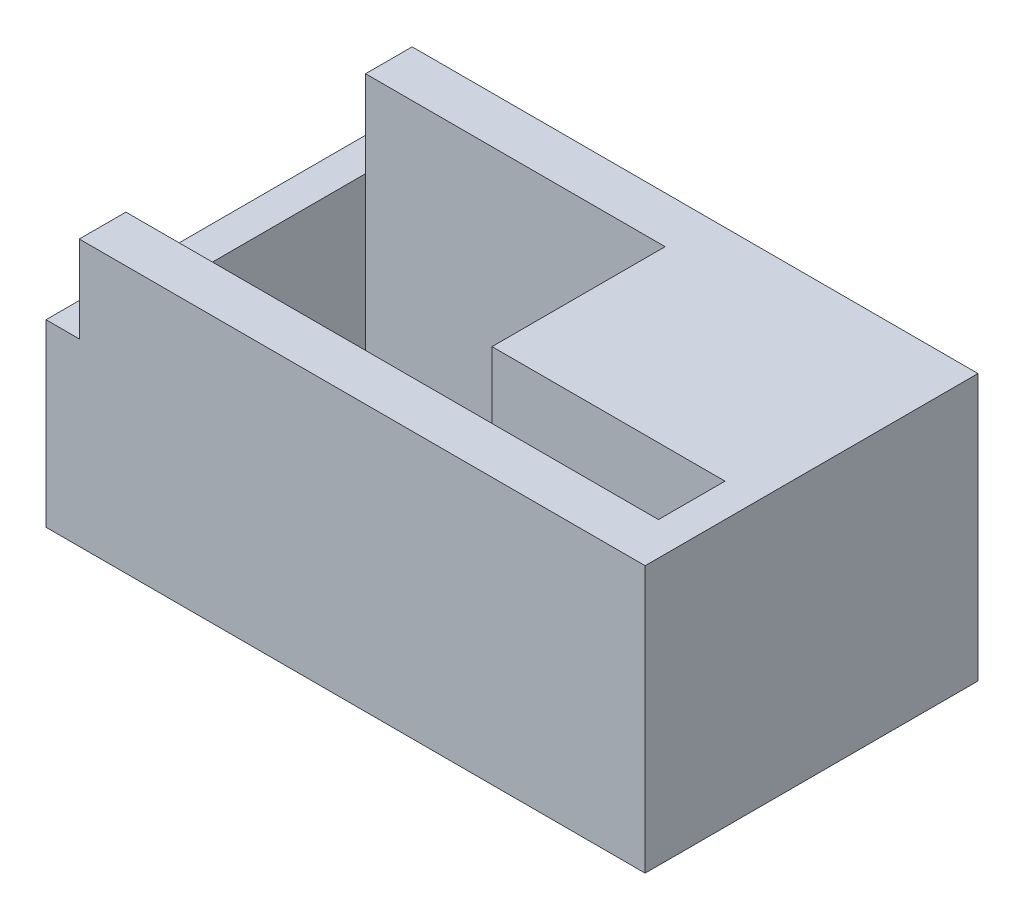
ISO-10303-21;
HEADER;
FILE_DESCRIPTION(('STEP AP214'),'2;1');
FILE_NAME('part.step','',(''),(''),'','','');
FILE_SCHEMA(('AUTOMOTIVE_DESIGN { 1 0 10303 214 1 1 1 1 }'));
ENDSEC;
DATA;
#1=APPLICATION_CONTEXT('core data for automotive mechanical design processes');
#2=APPLICATION_PROTOCOL_DEFINITION('international standard','automotive_design',2000,#1);
#3=PRODUCT_CONTEXT('',#1,'mechanical');
#4=PRODUCT('Part','Part','',(#3));
#5=PRODUCT_RELATED_PRODUCT_CATEGORY('part','',(#4));
#6=PRODUCT_DEFINITION_FORMATION('','',#4);
#7=PRODUCT_DEFINITION_CONTEXT('part definition',#1,'design');
#8=PRODUCT_DEFINITION('design','',#6,#7);
#9=PRODUCT_DEFINITION_SHAPE('','',#8);
#10=(LENGTH_UNIT() NAMED_UNIT(*) SI_UNIT(.MILLI.,.METRE.));
#11=(NAMED_UNIT(*) PLANE_ANGLE_UNIT() SI_UNIT($,.RADIAN.));
#12=(NAMED_UNIT(*) SI_UNIT($,.STERADIAN.) SOLID_ANGLE_UNIT());
#13=UNCERTAINTY_MEASURE_WITH_UNIT(LENGTH_MEASURE(1.E-05),#10,'distance_accuracy_value','');
#14=(GEOMETRIC_REPRESENTATION_CONTEXT(3) GLOBAL_UNCERTAINTY_ASSIGNED_CONTEXT((#13)) GLOBAL_UNIT_ASSIGNED_CONTEXT((#10,
#11,#12)) REPRESENTATION_CONTEXT('',''));
#15=CARTESIAN_POINT('',(0.,0.,0.));
#16=DIRECTION('',(0.,0.,1.));
#17=DIRECTION('',(1.,0.,0.));
#18=AXIS2_PLACEMENT_3D('',#15,#16,#17);
#19=CARTESIAN_POINT('',(0.,0.,0.));
#20=DIRECTION('',(1.,0.,0.));
#21=DIRECTION('',(0.,0.,-1.));
#22=AXIS2_PLACEMENT_3D('',#19,#20,#21);
#23=PLANE('',#22);
#24=DIRECTION('',(0.,0.,-1.));
#25=VECTOR('',#24,1.);
#26=CARTESIAN_POINT('',(0.,27.,50.));
#27=LINE('',#26,#25);
#28=CARTESIAN_POINT('',(0.,27.,50.));
#29=VERTEX_POINT('',#28);
#30=CARTESIAN_POINT('',(0.,27.,43.));
#31=VERTEX_POINT('',#30);
#32=EDGE_CURVE('E58',#29,#31,#27,.T.);
#33=ORIENTED_EDGE('',*,*,#32,.F.);
#34=DIRECTION('',(0.,-1.,0.));
#35=VECTOR('',#34,1.);
#36=CARTESIAN_POINT('',(0.,0.,50.));
#37=LINE('',#36,#35);
#38=CARTESIAN_POINT('',(0.,40.,50.));
#39=VERTEX_POINT('',#38);
#40=EDGE_CURVE('E169',#39,#29,#37,.T.);
#41=ORIENTED_EDGE('',*,*,#40,.F.);
#42=DIRECTION('',(0.,0.,1.));
#43=VECTOR('',#42,1.);
#44=CARTESIAN_POINT('',(0.,40.,0.));
#45=LINE('',#44,#43);
#46=CARTESIAN_POINT('',(0.,40.,43.));
#47=VERTEX_POINT('',#46);
#48=EDGE_CURVE('E238',#47,#39,#45,.T.);
#49=ORIENTED_EDGE('',*,*,#48,.F.);
#50=DIRECTION('',(0.,-1.,0.));
#51=VECTOR('',#50,1.);
#52=CARTESIAN_POINT('',(0.,0.,43.));
#53=LINE('',#52,#51);
#54=EDGE_CURVE('E44',#47,#31,#53,.T.);
#55=ORIENTED_EDGE('',*,*,#54,.T.);
#56=EDGE_LOOP('',(#33,#41,#49,#55));
#57=FACE_BOUND('',#56,.T.);
#58=ADVANCED_FACE('F36',(#57),#23,.F.);
#59=CARTESIAN_POINT('',(0.,27.,7.00000000000001));
#60=VERTEX_POINT('',#59);
#61=CARTESIAN_POINT('',(0.,27.,0.));
#62=VERTEX_POINT('',#61);
#63=EDGE_CURVE('E262',#60,#62,#27,.T.);
#64=ORIENTED_EDGE('',*,*,#63,.F.);
#65=DIRECTION('',(0.,1.,0.));
#66=VECTOR('',#65,1.);
#67=CARTESIAN_POINT('',(0.,0.,7.));
#68=LINE('',#67,#66);
#69=CARTESIAN_POINT('',(0.,40.,7.));
#70=VERTEX_POINT('',#69);
#71=EDGE_CURVE('E251',#60,#70,#68,.T.);
#72=ORIENTED_EDGE('',*,*,#71,.T.);
#73=CARTESIAN_POINT('',(0.,40.,0.));
#74=VERTEX_POINT('',#73);
#75=EDGE_CURVE('E239',#74,#70,#45,.T.);
#76=ORIENTED_EDGE('',*,*,#75,.F.);
#77=DIRECTION('',(0.,1.,0.));
#78=VECTOR('',#77,1.);
#79=CARTESIAN_POINT('',(0.,0.,0.));
#80=LINE('',#79,#78);
#81=EDGE_CURVE('E226',#62,#74,#80,.T.);
#82=ORIENTED_EDGE('',*,*,#81,.F.);
#83=EDGE_LOOP('',(#64,#72,#76,#82));
#84=FACE_BOUND('',#83,.T.);
#85=ADVANCED_FACE('F309',(#84),#23,.F.);
#86=CARTESIAN_POINT('',(80.,-20.,33.));
#87=DIRECTION('',(0.,0.,-1.));
#88=DIRECTION('',(-1.,0.,0.));
#89=AXIS2_PLACEMENT_3D('',#86,#87,#88);
#90=PLANE('',#89);
#91=DIRECTION('',(1.,0.,0.));
#92=VECTOR('',#91,1.);
#93=CARTESIAN_POINT('',(45.,25.,33.));
#94=LINE('',#93,#92);
#95=CARTESIAN_POINT('',(45.,25.,33.));
#96=VERTEX_POINT('',#95);
#97=CARTESIAN_POINT('',(80.,25.,33.));
#98=VERTEX_POINT('',#97);
#99=EDGE_CURVE('E185',#96,#98,#94,.T.);
#100=ORIENTED_EDGE('',*,*,#99,.T.);
#101=DIRECTION('',(0.,1.,0.));
#102=VECTOR('',#101,1.);
#103=CARTESIAN_POINT('',(80.,-20.,33.));
#104=LINE('',#103,#102);
#105=CARTESIAN_POINT('',(80.,40.,33.));
#106=VERTEX_POINT('',#105);
#107=EDGE_CURVE('E219',#98,#106,#104,.T.);
#108=ORIENTED_EDGE('',*,*,#107,.T.);
#109=DIRECTION('',(-1.,0.,0.));
#110=VECTOR('',#109,1.);
#111=CARTESIAN_POINT('',(80.,40.,33.));
#112=LINE('',#111,#110);
#113=CARTESIAN_POINT('',(45.,40.,33.));
#114=VERTEX_POINT('',#113);
#115=EDGE_CURVE('E212',#106,#114,#112,.T.);
#116=ORIENTED_EDGE('',*,*,#115,.T.);
#117=DIRECTION('',(0.,1.,0.));
#118=VECTOR('',#117,1.);
#119=CARTESIAN_POINT('',(45.,-20.,33.));
#120=LINE('',#119,#118);
#121=EDGE_CURVE('E216',#96,#114,#120,.T.);
#122=ORIENTED_EDGE('',*,*,#121,.F.);
#123=EDGE_LOOP('',(#100,#108,#116,#122));
#124=FACE_BOUND('',#123,.T.);
#125=ADVANCED_FACE('F294',(#124),#90,.F.);
#126=CARTESIAN_POINT('',(80.,-20.,43.));
#127=DIRECTION('',(1.,0.,0.));
#128=DIRECTION('',(0.,0.,-1.));
#129=AXIS2_PLACEMENT_3D('',#126,#127,#128);
#130=PLANE('',#129);
#131=DIRECTION('',(0.,0.,1.));
#132=VECTOR('',#131,1.);
#133=CARTESIAN_POINT('',(80.,25.,43.));
#134=LINE('',#133,#132);
#135=CARTESIAN_POINT('',(80.,25.,43.));
#136=VERTEX_POINT('',#135);
#137=EDGE_CURVE('E188',#98,#136,#134,.T.);
#138=ORIENTED_EDGE('',*,*,#137,.T.);
#139=DIRECTION('',(0.,1.,0.));
#140=VECTOR('',#139,1.);
#141=CARTESIAN_POINT('',(80.,-20.,43.));
#142=LINE('',#141,#140);
#143=CARTESIAN_POINT('',(80.,40.,43.));
#144=VERTEX_POINT('',#143);
#145=EDGE_CURVE('E221',#136,#144,#142,.T.);
#146=ORIENTED_EDGE('',*,*,#145,.T.);
#147=DIRECTION('',(0.,0.,-1.));
#148=VECTOR('',#147,1.);
#149=CARTESIAN_POINT('',(80.,40.,43.));
#150=LINE('',#149,#148);
#151=EDGE_CURVE('E209',#144,#106,#150,.T.);
#152=ORIENTED_EDGE('',*,*,#151,.T.);
#153=ORIENTED_EDGE('',*,*,#107,.F.);
#154=EDGE_LOOP('',(#138,#146,#152,#153));
#155=FACE_BOUND('',#154,.T.);
#156=ADVANCED_FACE('F288',(#155),#130,.F.);
#157=CARTESIAN_POINT('',(80.,-20.,43.));
#158=DIRECTION('',(0.,0.,1.));
#159=DIRECTION('',(0.,-1.,0.));
#160=AXIS2_PLACEMENT_3D('',#157,#158,#159);
#161=PLANE('',#160);
#162=DIRECTION('',(-1.,0.,0.));
#163=VECTOR('',#162,1.);
#164=CARTESIAN_POINT('',(45.,25.,43.0000000000001));
#165=LINE('',#164,#163);
#166=CARTESIAN_POINT('',(0.,25.,43.));
#167=VERTEX_POINT('',#166);
#168=EDGE_CURVE('E191',#136,#167,#165,.T.);
#169=ORIENTED_EDGE('',*,*,#168,.T.);
#170=DIRECTION('',(0.,-1.,0.));
#171=VECTOR('',#170,1.);
#172=CARTESIAN_POINT('',(0.,-20.,43.));
#173=LINE('',#172,#171);
#174=EDGE_CURVE('E51',#31,#167,#173,.T.);
#175=ORIENTED_EDGE('',*,*,#174,.F.);
#176=ORIENTED_EDGE('',*,*,#54,.F.);
#177=DIRECTION('',(1.,0.,0.));
#178=VECTOR('',#177,1.);
#179=CARTESIAN_POINT('',(80.,40.,43.));
#180=LINE('',#179,#178);
#181=EDGE_CURVE('E206',#47,#144,#180,.T.);
#182=ORIENTED_EDGE('',*,*,#181,.T.);
#183=ORIENTED_EDGE('',*,*,#145,.F.);
#184=EDGE_LOOP('',(#169,#175,#176,#182,#183));
#185=FACE_BOUND('',#184,.T.);
#186=ADVANCED_FACE('F286',(#185),#161,.F.);
#187=CARTESIAN_POINT('',(85.,0.,0.));
#188=DIRECTION('',(0.,0.,1.));
#189=DIRECTION('',(1.,0.,0.));
#190=AXIS2_PLACEMENT_3D('',#187,#188,#189);
#191=PLANE('',#190);
#192=DIRECTION('',(-1.,0.,0.));
#193=VECTOR('',#192,1.);
#194=CARTESIAN_POINT('',(85.,0.,0.));
#195=LINE('',#194,#193);
#196=CARTESIAN_POINT('',(85.,0.,0.));
#197=VERTEX_POINT('',#196);
#198=CARTESIAN_POINT('',(-5.,0.,0.));
#199=VERTEX_POINT('',#198);
#200=EDGE_CURVE('E236',#197,#199,#195,.T.);
#201=ORIENTED_EDGE('',*,*,#200,.T.);
#202=DIRECTION('',(0.,-1.,0.));
#203=VECTOR('',#202,1.);
#204=CARTESIAN_POINT('',(-5.,0.,0.));
#205=LINE('',#204,#203);
#206=CARTESIAN_POINT('',(-5.,27.,0.));
#207=VERTEX_POINT('',#206);
#208=EDGE_CURVE('E155',#207,#199,#205,.T.);
#209=ORIENTED_EDGE('',*,*,#208,.F.);
#210=DIRECTION('',(1.,0.,0.));
#211=VECTOR('',#210,1.);
#212=CARTESIAN_POINT('',(-5.,27.,0.));
#213=LINE('',#212,#211);
#214=EDGE_CURVE('E151',#207,#62,#213,.T.);
#215=ORIENTED_EDGE('',*,*,#214,.T.);
#216=ORIENTED_EDGE('',*,*,#81,.T.);
#217=DIRECTION('',(-1.,0.,0.));
#218=VECTOR('',#217,1.);
#219=CARTESIAN_POINT('',(85.,40.,0.));
#220=LINE('',#219,#218);
#221=CARTESIAN_POINT('',(85.,40.,0.));
#222=VERTEX_POINT('',#221);
#223=EDGE_CURVE('E248',#222,#74,#220,.T.);
#224=ORIENTED_EDGE('',*,*,#223,.F.);
#225=DIRECTION('',(0.,1.,0.));
#226=VECTOR('',#225,1.);
#227=CARTESIAN_POINT('',(85.,0.,0.));
#228=LINE('',#227,#226);
#229=EDGE_CURVE('E227',#197,#222,#228,.T.);
#230=ORIENTED_EDGE('',*,*,#229,.F.);
#231=EDGE_LOOP('',(#201,#209,#215,#216,#224,#230));
#232=FACE_BOUND('',#231,.T.);
#233=ADVANCED_FACE('F38',(#232),#191,.F.);
#234=CARTESIAN_POINT('',(85.,40.,0.));
#235=DIRECTION('',(0.,-1.,0.));
#236=DIRECTION('',(0.,0.,-1.));
#237=AXIS2_PLACEMENT_3D('',#234,#235,#236);
#238=PLANE('',#237);
#239=ORIENTED_EDGE('',*,*,#151,.F.);
#240=ORIENTED_EDGE('',*,*,#181,.F.);
#241=ORIENTED_EDGE('',*,*,#48,.T.);
#242=DIRECTION('',(-1.,0.,0.));
#243=VECTOR('',#242,1.);
#244=CARTESIAN_POINT('',(85.,40.,50.));
#245=LINE('',#244,#243);
#246=CARTESIAN_POINT('',(85.,40.,50.));
#247=VERTEX_POINT('',#246);
#248=EDGE_CURVE('E246',#247,#39,#245,.T.);
#249=ORIENTED_EDGE('',*,*,#248,.F.);
#250=DIRECTION('',(0.,0.,1.));
#251=VECTOR('',#250,1.);
#252=CARTESIAN_POINT('',(85.,40.,0.));
#253=LINE('',#252,#251);
#254=EDGE_CURVE('E230',#222,#247,#253,.T.);
#255=ORIENTED_EDGE('',*,*,#254,.F.);
#256=ORIENTED_EDGE('',*,*,#223,.T.);
#257=ORIENTED_EDGE('',*,*,#75,.T.);
#258=DIRECTION('',(-1.,0.,0.));
#259=VECTOR('',#258,1.);
#260=CARTESIAN_POINT('',(45.,40.,7.));
#261=LINE('',#260,#259);
#262=CARTESIAN_POINT('',(45.,40.,7.));
#263=VERTEX_POINT('',#262);
#264=EDGE_CURVE('E203',#263,#70,#261,.T.);
#265=ORIENTED_EDGE('',*,*,#264,.F.);
#266=DIRECTION('',(0.,0.,-1.));
#267=VECTOR('',#266,1.);
#268=CARTESIAN_POINT('',(45.,40.,7.));
#269=LINE('',#268,#267);
#270=EDGE_CURVE('E198',#114,#263,#269,.T.);
#271=ORIENTED_EDGE('',*,*,#270,.F.);
#272=ORIENTED_EDGE('',*,*,#115,.F.);
#273=EDGE_LOOP('',(#239,#240,#241,#249,#255,#256,#257,#265,#271,#272));
#274=FACE_BOUND('',#273,.T.);
#275=ADVANCED_FACE('F283',(#274),#238,.F.);
#276=CARTESIAN_POINT('',(85.,0.,50.));
#277=DIRECTION('',(0.,0.,-1.));
#278=DIRECTION('',(-1.,0.,0.));
#279=AXIS2_PLACEMENT_3D('',#276,#277,#278);
#280=PLANE('',#279);
#281=ORIENTED_EDGE('',*,*,#40,.T.);
#282=DIRECTION('',(1.,0.,0.));
#283=VECTOR('',#282,1.);
#284=CARTESIAN_POINT('',(-5.,27.,50.));
#285=LINE('',#284,#283);
#286=CARTESIAN_POINT('',(-5.,27.,50.));
#287=VERTEX_POINT('',#286);
#288=EDGE_CURVE('E148',#287,#29,#285,.T.);
#289=ORIENTED_EDGE('',*,*,#288,.F.);
#290=DIRECTION('',(0.,1.,0.));
#291=VECTOR('',#290,1.);
#292=CARTESIAN_POINT('',(-5.,0.,50.));
#293=LINE('',#292,#291);
#294=CARTESIAN_POINT('',(-5.,0.,50.));
#295=VERTEX_POINT('',#294);
#296=EDGE_CURVE('E156',#295,#287,#293,.T.);
#297=ORIENTED_EDGE('',*,*,#296,.F.);
#298=DIRECTION('',(-1.,0.,0.));
#299=VECTOR('',#298,1.);
#300=CARTESIAN_POINT('',(85.,0.,50.));
#301=LINE('',#300,#299);
#302=CARTESIAN_POINT('',(85.,0.,50.));
#303=VERTEX_POINT('',#302);
#304=EDGE_CURVE('E244',#303,#295,#301,.T.);
#305=ORIENTED_EDGE('',*,*,#304,.F.);
#306=DIRECTION('',(0.,-1.,0.));
#307=VECTOR('',#306,1.);
#308=CARTESIAN_POINT('',(85.,0.,50.));
#309=LINE('',#308,#307);
#310=EDGE_CURVE('E232',#247,#303,#309,.T.);
#311=ORIENTED_EDGE('',*,*,#310,.F.);
#312=ORIENTED_EDGE('',*,*,#248,.T.);
#313=EDGE_LOOP('',(#281,#289,#297,#305,#311,#312));
#314=FACE_BOUND('',#313,.T.);
#315=ADVANCED_FACE('F167',(#314),#280,.F.);
#316=CARTESIAN_POINT('',(85.,0.,0.));
#317=DIRECTION('',(0.,1.,0.));
#318=DIRECTION('',(0.,0.,1.));
#319=AXIS2_PLACEMENT_3D('',#316,#317,#318);
#320=PLANE('',#319);
#321=DIRECTION('',(0.,0.,1.));
#322=VECTOR('',#321,1.);
#323=CARTESIAN_POINT('',(0.,0.,50.));
#324=LINE('',#323,#322);
#325=CARTESIAN_POINT('',(0.,0.,7.));
#326=VERTEX_POINT('',#325);
#327=CARTESIAN_POINT('',(0.,0.,28.0000000000001));
#328=VERTEX_POINT('',#327);
#329=EDGE_CURVE('E165',#326,#328,#324,.T.);
#330=ORIENTED_EDGE('',*,*,#329,.T.);
#331=DIRECTION('',(1.,0.,0.));
#332=VECTOR('',#331,1.);
#333=CARTESIAN_POINT('',(0.,0.,28.0000000000001));
#334=LINE('',#333,#332);
#335=CARTESIAN_POINT('',(45.,0.,28.0000000000001));
#336=VERTEX_POINT('',#335);
#337=EDGE_CURVE('E171',#328,#336,#334,.T.);
#338=ORIENTED_EDGE('',*,*,#337,.T.);
#339=DIRECTION('',(0.,0.,-1.));
#340=VECTOR('',#339,1.);
#341=CARTESIAN_POINT('',(45.,0.,0.));
#342=LINE('',#341,#340);
#343=CARTESIAN_POINT('',(45.,0.,7.));
#344=VERTEX_POINT('',#343);
#345=EDGE_CURVE('E11',#336,#344,#342,.T.);
#346=ORIENTED_EDGE('',*,*,#345,.T.);
#347=DIRECTION('',(-1.,0.,0.));
#348=VECTOR('',#347,1.);
#349=CARTESIAN_POINT('',(85.,0.,6.99999999999999));
#350=LINE('',#349,#348);
#351=EDGE_CURVE('E218',#344,#326,#350,.T.);
#352=ORIENTED_EDGE('',*,*,#351,.T.);
#353=EDGE_LOOP('',(#330,#338,#346,#352));
#354=FACE_BOUND('',#353,.T.);
#355=ORIENTED_EDGE('',*,*,#304,.T.);
#356=DIRECTION('',(0.,0.,1.));
#357=VECTOR('',#356,1.);
#358=CARTESIAN_POINT('',(-5.,0.,50.));
#359=LINE('',#358,#357);
#360=EDGE_CURVE('E162',#199,#295,#359,.T.);
#361=ORIENTED_EDGE('',*,*,#360,.F.);
#362=ORIENTED_EDGE('',*,*,#200,.F.);
#363=DIRECTION('',(0.,0.,-1.));
#364=VECTOR('',#363,1.);
#365=CARTESIAN_POINT('',(85.,0.,0.));
#366=LINE('',#365,#364);
#367=EDGE_CURVE('E234',#303,#197,#366,.T.);
#368=ORIENTED_EDGE('',*,*,#367,.F.);
#369=EDGE_LOOP('',(#355,#361,#362,#368));
#370=FACE_BOUND('',#369,.T.);
#371=ADVANCED_FACE('F275',(#354,#370),#320,.F.);
#372=CARTESIAN_POINT('',(85.,0.,0.));
#373=DIRECTION('',(1.,0.,0.));
#374=DIRECTION('',(0.,0.,-1.));
#375=AXIS2_PLACEMENT_3D('',#372,#373,#374);
#376=PLANE('',#375);
#377=ORIENTED_EDGE('',*,*,#229,.T.);
#378=ORIENTED_EDGE('',*,*,#254,.T.);
#379=ORIENTED_EDGE('',*,*,#310,.T.);
#380=ORIENTED_EDGE('',*,*,#367,.T.);
#381=EDGE_LOOP('',(#377,#378,#379,#380));
#382=FACE_BOUND('',#381,.T.);
#383=ADVANCED_FACE('F280',(#382),#376,.T.);
#384=CARTESIAN_POINT('',(45.,-20.,6.99999999999999));
#385=DIRECTION('',(1.,0.,0.));
#386=DIRECTION('',(0.,0.,-1.));
#387=AXIS2_PLACEMENT_3D('',#384,#385,#386);
#388=PLANE('',#387);
#389=ORIENTED_EDGE('',*,*,#345,.F.);
#390=DIRECTION('',(0.,-1.,0.));
#391=VECTOR('',#390,1.);
#392=CARTESIAN_POINT('',(45.,25.,28.0000000000001));
#393=LINE('',#392,#391);
#394=CARTESIAN_POINT('',(45.,25.,28.0000000000001));
#395=VERTEX_POINT('',#394);
#396=EDGE_CURVE('E196',#395,#336,#393,.T.);
#397=ORIENTED_EDGE('',*,*,#396,.F.);
#398=DIRECTION('',(0.,0.,1.));
#399=VECTOR('',#398,1.);
#400=CARTESIAN_POINT('',(45.,25.,33.));
#401=LINE('',#400,#399);
#402=EDGE_CURVE('E182',#395,#96,#401,.T.);
#403=ORIENTED_EDGE('',*,*,#402,.T.);
#404=ORIENTED_EDGE('',*,*,#121,.T.);
#405=ORIENTED_EDGE('',*,*,#270,.T.);
#406=DIRECTION('',(0.,1.,0.));
#407=VECTOR('',#406,1.);
#408=CARTESIAN_POINT('',(45.,-20.,6.99999999999999));
#409=LINE('',#408,#407);
#410=EDGE_CURVE('E215',#344,#263,#409,.T.);
#411=ORIENTED_EDGE('',*,*,#410,.F.);
#412=EDGE_LOOP('',(#389,#397,#403,#404,#405,#411));
#413=FACE_BOUND('',#412,.T.);
#414=ADVANCED_FACE('F298',(#413),#388,.F.);
#415=CARTESIAN_POINT('',(45.,-20.,6.99999999999999));
#416=DIRECTION('',(0.,0.,-1.));
#417=DIRECTION('',(0.,1.,0.));
#418=AXIS2_PLACEMENT_3D('',#415,#416,#417);
#419=PLANE('',#418);
#420=ORIENTED_EDGE('',*,*,#410,.T.);
#421=ORIENTED_EDGE('',*,*,#264,.T.);
#422=ORIENTED_EDGE('',*,*,#71,.F.);
#423=EDGE_CURVE('E252',#326,#60,#68,.T.);
#424=ORIENTED_EDGE('',*,*,#423,.F.);
#425=ORIENTED_EDGE('',*,*,#351,.F.);
#426=EDGE_LOOP('',(#420,#421,#422,#424,#425));
#427=FACE_BOUND('',#426,.T.);
#428=ADVANCED_FACE('F308',(#427),#419,.F.);
#429=CARTESIAN_POINT('',(0.,25.,28.0000000000001));
#430=DIRECTION('',(0.,0.,-1.));
#431=DIRECTION('',(0.,1.,0.));
#432=AXIS2_PLACEMENT_3D('',#429,#430,#431);
#433=PLANE('',#432);
#434=ORIENTED_EDGE('',*,*,#337,.F.);
#435=DIRECTION('',(0.,-1.,0.));
#436=VECTOR('',#435,1.);
#437=CARTESIAN_POINT('',(0.,25.,28.0000000000001));
#438=LINE('',#437,#436);
#439=CARTESIAN_POINT('',(0.,25.,28.0000000000001));
#440=VERTEX_POINT('',#439);
#441=EDGE_CURVE('E193',#440,#328,#438,.T.);
#442=ORIENTED_EDGE('',*,*,#441,.F.);
#443=DIRECTION('',(1.,0.,0.));
#444=VECTOR('',#443,1.);
#445=CARTESIAN_POINT('',(0.,25.,28.0000000000001));
#446=LINE('',#445,#444);
#447=EDGE_CURVE('E179',#440,#395,#446,.T.);
#448=ORIENTED_EDGE('',*,*,#447,.T.);
#449=ORIENTED_EDGE('',*,*,#396,.T.);
#450=EDGE_LOOP('',(#434,#442,#448,#449));
#451=FACE_BOUND('',#450,.T.);
#452=ADVANCED_FACE('F304',(#451),#433,.T.);
#453=CARTESIAN_POINT('',(0.,25.,0.));
#454=DIRECTION('',(0.,-1.,0.));
#455=DIRECTION('',(0.,0.,-1.));
#456=AXIS2_PLACEMENT_3D('',#453,#454,#455);
#457=PLANE('',#456);
#458=DIRECTION('',(0.,0.,-1.));
#459=VECTOR('',#458,1.);
#460=CARTESIAN_POINT('',(0.,25.,43.));
#461=LINE('',#460,#459);
#462=EDGE_CURVE('E176',#167,#440,#461,.T.);
#463=ORIENTED_EDGE('',*,*,#462,.F.);
#464=ORIENTED_EDGE('',*,*,#168,.F.);
#465=ORIENTED_EDGE('',*,*,#137,.F.);
#466=ORIENTED_EDGE('',*,*,#99,.F.);
#467=ORIENTED_EDGE('',*,*,#402,.F.);
#468=ORIENTED_EDGE('',*,*,#447,.F.);
#469=EDGE_LOOP('',(#463,#464,#465,#466,#467,#468));
#470=FACE_BOUND('',#469,.T.);
#471=ADVANCED_FACE('F291',(#470),#457,.F.);
#472=CARTESIAN_POINT('',(0.,0.,0.));
#473=DIRECTION('',(-1.,0.,0.));
#474=DIRECTION('',(0.,0.,1.));
#475=AXIS2_PLACEMENT_3D('',#472,#473,#474);
#476=PLANE('',#475);
#477=ORIENTED_EDGE('',*,*,#329,.F.);
#478=ORIENTED_EDGE('',*,*,#423,.T.);
#479=EDGE_CURVE('E259',#31,#60,#27,.T.);
#480=ORIENTED_EDGE('',*,*,#479,.F.);
#481=ORIENTED_EDGE('',*,*,#174,.T.);
#482=ORIENTED_EDGE('',*,*,#462,.T.);
#483=ORIENTED_EDGE('',*,*,#441,.T.);
#484=EDGE_LOOP('',(#477,#478,#480,#481,#482,#483));
#485=FACE_BOUND('',#484,.T.);
#486=ADVANCED_FACE('F261',(#485),#476,.F.);
#487=CARTESIAN_POINT('',(-5.,27.,50.));
#488=DIRECTION('',(0.,-1.,0.));
#489=DIRECTION('',(0.,0.,-1.));
#490=AXIS2_PLACEMENT_3D('',#487,#488,#489);
#491=PLANE('',#490);
#492=ORIENTED_EDGE('',*,*,#32,.T.);
#493=ORIENTED_EDGE('',*,*,#479,.T.);
#494=ORIENTED_EDGE('',*,*,#63,.T.);
#495=ORIENTED_EDGE('',*,*,#214,.F.);
#496=DIRECTION('',(0.,0.,-1.));
#497=VECTOR('',#496,1.);
#498=CARTESIAN_POINT('',(-5.,27.,50.));
#499=LINE('',#498,#497);
#500=EDGE_CURVE('E144',#287,#207,#499,.T.);
#501=ORIENTED_EDGE('',*,*,#500,.F.);
#502=ORIENTED_EDGE('',*,*,#288,.T.);
#503=EDGE_LOOP('',(#492,#493,#494,#495,#501,#502));
#504=FACE_BOUND('',#503,.T.);
#505=ADVANCED_FACE('F146',(#504),#491,.F.);
#506=CARTESIAN_POINT('',(-5.,0.,0.));
#507=DIRECTION('',(-1.,0.,0.));
#508=DIRECTION('',(0.,0.,1.));
#509=AXIS2_PLACEMENT_3D('',#506,#507,#508);
#510=PLANE('',#509);
#511=ORIENTED_EDGE('',*,*,#296,.T.);
#512=ORIENTED_EDGE('',*,*,#500,.T.);
#513=ORIENTED_EDGE('',*,*,#208,.T.);
#514=ORIENTED_EDGE('',*,*,#360,.T.);
#515=EDGE_LOOP('',(#511,#512,#513,#514));
#516=FACE_BOUND('',#515,.T.);
#517=ADVANCED_FACE('F160',(#516),#510,.T.);
#518=CLOSED_SHELL('',(#58,#85,#125,#156,#186,#233,#275,#315,#371,#383,#414,#428,#452,#471,#486,
#505,#517));
#519=MANIFOLD_SOLID_BREP('B2',#518);
#520=ADVANCED_BREP_SHAPE_REPRESENTATION('',(#18,#519),#14);
#521=SHAPE_DEFINITION_REPRESENTATION(#9,#520);
ENDSEC;
END-ISO-10303-21;
